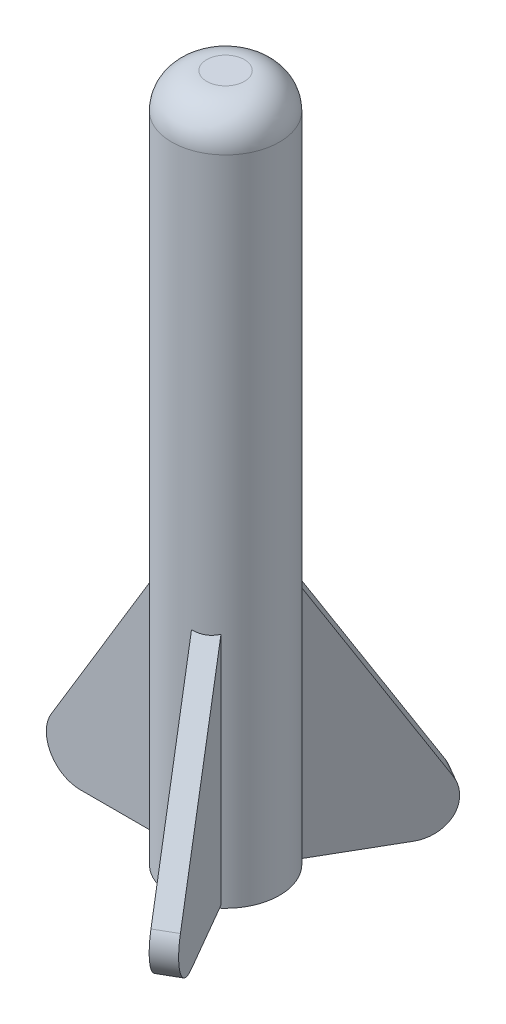
ISO-10303-21;
HEADER;
FILE_DESCRIPTION(('STEP AP214'),'2;1');
FILE_NAME('part.step','',(''),(''),'','','');
FILE_SCHEMA(('AUTOMOTIVE_DESIGN { 1 0 10303 214 1 1 1 1 }'));
ENDSEC;
DATA;
#1=APPLICATION_CONTEXT('core data for automotive mechanical design processes');
#2=APPLICATION_PROTOCOL_DEFINITION('international standard','automotive_design',2000,#1);
#3=PRODUCT_CONTEXT('',#1,'mechanical');
#4=PRODUCT('Part','Part','',(#3));
#5=PRODUCT_RELATED_PRODUCT_CATEGORY('part','',(#4));
#6=PRODUCT_DEFINITION_FORMATION('','',#4);
#7=PRODUCT_DEFINITION_CONTEXT('part definition',#1,'design');
#8=PRODUCT_DEFINITION('design','',#6,#7);
#9=PRODUCT_DEFINITION_SHAPE('','',#8);
#10=(LENGTH_UNIT() NAMED_UNIT(*) SI_UNIT(.MILLI.,.METRE.));
#11=(NAMED_UNIT(*) PLANE_ANGLE_UNIT() SI_UNIT($,.RADIAN.));
#12=(NAMED_UNIT(*) SI_UNIT($,.STERADIAN.) SOLID_ANGLE_UNIT());
#13=UNCERTAINTY_MEASURE_WITH_UNIT(LENGTH_MEASURE(1.E-05),#10,'distance_accuracy_value','');
#14=(GEOMETRIC_REPRESENTATION_CONTEXT(3) GLOBAL_UNCERTAINTY_ASSIGNED_CONTEXT((#13)) GLOBAL_UNIT_ASSIGNED_CONTEXT((#10,
#11,#12)) REPRESENTATION_CONTEXT('',''));
#15=CARTESIAN_POINT('',(0.,0.,0.));
#16=DIRECTION('',(0.,0.,1.));
#17=DIRECTION('',(1.,0.,0.));
#18=AXIS2_PLACEMENT_3D('',#15,#16,#17);
#19=CARTESIAN_POINT('',(0.,64.77,0.));
#20=DIRECTION('',(0.,-1.,0.));
#21=DIRECTION('',(0.,0.,-1.));
#22=AXIS2_PLACEMENT_3D('',#19,#20,#21);
#23=CYLINDRICAL_SURFACE('',#22,5.08);
#24=DIRECTION('',(0.,-1.,0.));
#25=VECTOR('',#24,1.);
#26=CARTESIAN_POINT('',(1.60879976842274,64.77,-4.81852293811319));
#27=LINE('',#26,#25);
#28=CARTESIAN_POINT('',(1.60879976842274,0.254000000000001,-4.81852293811319));
#29=VERTEX_POINT('',#28);
#30=CARTESIAN_POINT('',(1.60879976842274,22.3554057622066,-4.81852293811319));
#31=VERTEX_POINT('',#30);
#32=EDGE_CURVE('E226',#29,#31,#27,.F.);
#33=ORIENTED_EDGE('',*,*,#32,.F.);
#34=CARTESIAN_POINT('',(0.,0.254000000000004,0.));
#35=DIRECTION('',(0.,-1.,0.));
#36=DIRECTION('',(0.,0.,-1.));
#37=AXIS2_PLACEMENT_3D('',#34,#35,#36);
#38=CIRCLE('',#37,5.08);
#39=CARTESIAN_POINT('',(3.36856338891272,0.254000000000001,-3.80252293811318));
#40=VERTEX_POINT('',#39);
#41=EDGE_CURVE('E220',#29,#40,#38,.T.);
#42=ORIENTED_EDGE('',*,*,#41,.T.);
#43=DIRECTION('',(0.,-1.,0.));
#44=VECTOR('',#43,1.);
#45=CARTESIAN_POINT('',(3.36856338891272,64.77,-3.80252293811318));
#46=LINE('',#45,#44);
#47=CARTESIAN_POINT('',(3.36856338891272,22.3554057622066,-3.80252293811318));
#48=VERTEX_POINT('',#47);
#49=EDGE_CURVE('E217',#40,#48,#46,.F.);
#50=ORIENTED_EDGE('',*,*,#49,.T.);
#51=CARTESIAN_POINT('',(0.,30.595842527605,0.));
#52=DIRECTION('',(0.427986136650904,0.517021728110673,-0.741293733614474));
#53=DIRECTION('',(0.258510864055339,-0.855972273301801,-0.447753950852373));
#54=AXIS2_PLACEMENT_3D('',#51,#52,#53);
#55=ELLIPSE('',#54,9.82550582267324,5.08);
#56=EDGE_CURVE('E223',#48,#31,#55,.T.);
#57=ORIENTED_EDGE('',*,*,#56,.T.);
#58=EDGE_LOOP('',(#33,#42,#50,#57));
#59=FACE_BOUND('',#58,.T.);
#60=CARTESIAN_POINT('',(0.,0.,0.));
#61=DIRECTION('',(0.,1.,0.));
#62=DIRECTION('',(0.,0.,1.));
#63=AXIS2_PLACEMENT_3D('',#60,#61,#62);
#64=CIRCLE('',#63,5.08);
#65=CARTESIAN_POINT('',(0.,0.,5.08));
#66=VERTEX_POINT('',#65);
#67=EDGE_CURVE('E197',#66,#66,#64,.T.);
#68=ORIENTED_EDGE('',*,*,#67,.T.);
#69=EDGE_LOOP('',(#68));
#70=FACE_BOUND('',#69,.T.);
#71=CARTESIAN_POINT('',(0.,61.468,0.));
#72=DIRECTION('',(0.,1.,0.));
#73=DIRECTION('',(0.,0.,1.));
#74=AXIS2_PLACEMENT_3D('',#71,#72,#73);
#75=CIRCLE('',#74,5.08);
#76=CARTESIAN_POINT('',(0.,61.468,5.08));
#77=VERTEX_POINT('',#76);
#78=EDGE_CURVE('E203',#77,#77,#75,.F.);
#79=ORIENTED_EDGE('',*,*,#78,.T.);
#80=EDGE_LOOP('',(#79));
#81=FACE_BOUND('',#80,.T.);
#82=DIRECTION('',(0.,-1.,0.));
#83=VECTOR('',#82,1.);
#84=CARTESIAN_POINT('',(-4.97736315733542,64.77,1.016));
#85=LINE('',#84,#83);
#86=CARTESIAN_POINT('',(-4.97736315733542,0.254000000000001,1.016));
#87=VERTEX_POINT('',#86);
#88=CARTESIAN_POINT('',(-4.97736315733542,22.3554057622066,1.016));
#89=VERTEX_POINT('',#88);
#90=EDGE_CURVE('E215',#87,#89,#85,.F.);
#91=ORIENTED_EDGE('',*,*,#90,.F.);
#92=CARTESIAN_POINT('',(0.,0.254000000000004,0.));
#93=DIRECTION('',(0.,-1.,0.));
#94=DIRECTION('',(1.,0.,0.));
#95=AXIS2_PLACEMENT_3D('',#92,#93,#94);
#96=CIRCLE('',#95,5.08);
#97=CARTESIAN_POINT('',(-4.97736315733542,0.254000000000001,-1.016));
#98=VERTEX_POINT('',#97);
#99=EDGE_CURVE('E209',#87,#98,#96,.T.);
#100=ORIENTED_EDGE('',*,*,#99,.T.);
#101=DIRECTION('',(0.,-1.,0.));
#102=VECTOR('',#101,1.);
#103=CARTESIAN_POINT('',(-4.97736315733542,64.77,-1.016));
#104=LINE('',#103,#102);
#105=CARTESIAN_POINT('',(-4.97736315733542,22.3554057622066,-1.016));
#106=VERTEX_POINT('',#105);
#107=EDGE_CURVE('E206',#98,#106,#104,.F.);
#108=ORIENTED_EDGE('',*,*,#107,.T.);
#109=CARTESIAN_POINT('',(0.,30.595842527605,0.));
#110=DIRECTION('',(-0.855972273301801,0.517021728110673,0.));
#111=DIRECTION('',(-0.517021728110673,-0.855972273301801,0.));
#112=AXIS2_PLACEMENT_3D('',#109,#110,#111);
#113=ELLIPSE('',#112,9.82550582267324,5.08);
#114=EDGE_CURVE('E212',#106,#89,#113,.T.);
#115=ORIENTED_EDGE('',*,*,#114,.T.);
#116=EDGE_LOOP('',(#91,#100,#108,#115));
#117=FACE_BOUND('',#116,.T.);
#118=DIRECTION('',(0.,-1.,0.));
#119=VECTOR('',#118,1.);
#120=CARTESIAN_POINT('',(3.36856338891266,64.77,3.80252293811323));
#121=LINE('',#120,#119);
#122=CARTESIAN_POINT('',(3.36856338891266,0.254000000000001,3.80252293811323));
#123=VERTEX_POINT('',#122);
#124=CARTESIAN_POINT('',(3.36856338891267,22.3554057622066,3.80252293811323));
#125=VERTEX_POINT('',#124);
#126=EDGE_CURVE('E11',#123,#125,#121,.F.);
#127=ORIENTED_EDGE('',*,*,#126,.F.);
#128=CARTESIAN_POINT('',(0.,0.254000000000004,0.));
#129=DIRECTION('',(0.,-1.,0.));
#130=DIRECTION('',(0.,0.,-1.));
#131=AXIS2_PLACEMENT_3D('',#128,#129,#130);
#132=CIRCLE('',#131,5.08);
#133=CARTESIAN_POINT('',(1.60879976842267,0.254000000000001,4.81852293811321));
#134=VERTEX_POINT('',#133);
#135=EDGE_CURVE('E129',#123,#134,#132,.T.);
#136=ORIENTED_EDGE('',*,*,#135,.T.);
#137=DIRECTION('',(0.,-1.,0.));
#138=VECTOR('',#137,1.);
#139=CARTESIAN_POINT('',(1.60879976842268,64.77,4.81852293811321));
#140=LINE('',#139,#138);
#141=CARTESIAN_POINT('',(1.60879976842268,22.3554057622066,4.81852293811321));
#142=VERTEX_POINT('',#141);
#143=EDGE_CURVE('E228',#134,#142,#140,.F.);
#144=ORIENTED_EDGE('',*,*,#143,.T.);
#145=CARTESIAN_POINT('',(0.,30.595842527605,0.));
#146=DIRECTION('',(0.427986136650894,0.517021728110673,0.74129373361448));
#147=DIRECTION('',(0.258510864055332,-0.855972273301801,0.447753950852376));
#148=AXIS2_PLACEMENT_3D('',#145,#146,#147);
#149=ELLIPSE('',#148,9.82550582267324,5.08);
#150=EDGE_CURVE('E40',#142,#125,#149,.T.);
#151=ORIENTED_EDGE('',*,*,#150,.T.);
#152=EDGE_LOOP('',(#127,#136,#144,#151));
#153=FACE_BOUND('',#152,.T.);
#154=ADVANCED_FACE('F32',(#59,#70,#81,#117,#153),#23,.T.);
#155=CARTESIAN_POINT('',(0.,0.,0.));
#156=DIRECTION('',(0.,1.,0.));
#157=DIRECTION('',(0.,0.,1.));
#158=AXIS2_PLACEMENT_3D('',#155,#156,#157);
#159=PLANE('',#158);
#160=ORIENTED_EDGE('',*,*,#67,.F.);
#161=EDGE_LOOP('',(#160));
#162=FACE_BOUND('',#161,.T.);
#163=CARTESIAN_POINT('',(0.,0.,0.));
#164=DIRECTION('',(0.,-1.,0.));
#165=DIRECTION('',(1.,0.,0.));
#166=AXIS2_PLACEMENT_3D('',#163,#164,#165);
#167=CIRCLE('',#166,2.79399999999999);
#168=CARTESIAN_POINT('',(2.79399999999999,0.,0.));
#169=VERTEX_POINT('',#168);
#170=EDGE_CURVE('E189',#169,#169,#167,.T.);
#171=ORIENTED_EDGE('',*,*,#170,.F.);
#172=EDGE_LOOP('',(#171));
#173=FACE_BOUND('',#172,.T.);
#174=ADVANCED_FACE('F246',(#162,#173),#159,.F.);
#175=CARTESIAN_POINT('',(0.,64.77,0.));
#176=DIRECTION('',(0.,1.,0.));
#177=DIRECTION('',(0.,0.,1.));
#178=AXIS2_PLACEMENT_3D('',#175,#176,#177);
#179=PLANE('',#178);
#180=CARTESIAN_POINT('',(0.,64.77,0.));
#181=DIRECTION('',(0.,1.,0.));
#182=DIRECTION('',(0.,0.,1.));
#183=AXIS2_PLACEMENT_3D('',#180,#181,#182);
#184=CIRCLE('',#183,1.778);
#185=CARTESIAN_POINT('',(0.,64.77,1.778));
#186=VERTEX_POINT('',#185);
#187=EDGE_CURVE('E200',#186,#186,#184,.T.);
#188=ORIENTED_EDGE('',*,*,#187,.T.);
#189=EDGE_LOOP('',(#188));
#190=FACE_BOUND('',#189,.T.);
#191=ADVANCED_FACE('F251',(#190),#179,.T.);
#192=CARTESIAN_POINT('',(0.,61.468,0.));
#193=DIRECTION('',(0.,1.,0.));
#194=DIRECTION('',(0.,0.,1.));
#195=AXIS2_PLACEMENT_3D('',#192,#193,#194);
#196=DEGENERATE_TOROIDAL_SURFACE('',#195,1.778,3.302,.T.);
#197=ORIENTED_EDGE('',*,*,#78,.F.);
#198=EDGE_LOOP('',(#197));
#199=FACE_BOUND('',#198,.T.);
#200=ORIENTED_EDGE('',*,*,#187,.F.);
#201=EDGE_LOOP('',(#200));
#202=FACE_BOUND('',#201,.T.);
#203=ADVANCED_FACE('F34',(#199,#202),#196,.T.);
#204=CARTESIAN_POINT('',(0.,33.0835,0.));
#205=DIRECTION('',(0.,-1.,0.));
#206=DIRECTION('',(1.,0.,0.));
#207=AXIS2_PLACEMENT_3D('',#204,#205,#206);
#208=PLANE('',#207);
#209=CARTESIAN_POINT('',(0.,33.0835,0.));
#210=DIRECTION('',(0.,-1.,0.));
#211=DIRECTION('',(1.,0.,0.));
#212=AXIS2_PLACEMENT_3D('',#209,#210,#211);
#213=CIRCLE('',#212,2.794);
#214=CARTESIAN_POINT('',(2.794,33.0835,0.));
#215=VERTEX_POINT('',#214);
#216=EDGE_CURVE('E194',#215,#215,#213,.T.);
#217=ORIENTED_EDGE('',*,*,#216,.T.);
#218=EDGE_LOOP('',(#217));
#219=FACE_BOUND('',#218,.T.);
#220=ADVANCED_FACE('F260',(#219),#208,.T.);
#221=CARTESIAN_POINT('',(0.,33.0835,0.));
#222=DIRECTION('',(0.,-1.,0.));
#223=DIRECTION('',(1.,0.,0.));
#224=AXIS2_PLACEMENT_3D('',#221,#222,#223);
#225=CYLINDRICAL_SURFACE('',#224,2.79399999999999);
#226=ORIENTED_EDGE('',*,*,#170,.T.);
#227=EDGE_LOOP('',(#226));
#228=FACE_BOUND('',#227,.T.);
#229=ORIENTED_EDGE('',*,*,#216,.F.);
#230=EDGE_LOOP('',(#229));
#231=FACE_BOUND('',#230,.T.);
#232=ADVANCED_FACE('F263',(#228,#231),#225,.F.);
#233=CARTESIAN_POINT('',(-15.4177119677332,5.07054398675139,1.016));
#234=DIRECTION('',(-0.855972273301801,0.517021728110673,0.));
#235=DIRECTION('',(-0.517021728110673,-0.855972273301801,0.));
#236=AXIS2_PLACEMENT_3D('',#233,#234,#235);
#237=PLANE('',#236);
#238=ORIENTED_EDGE('',*,*,#114,.F.);
#239=DIRECTION('',(0.517021728110673,0.855972273301801,0.));
#240=VECTOR('',#239,1.);
#241=CARTESIAN_POINT('',(-15.4177119677332,5.07054398675139,-1.016));
#242=LINE('',#241,#240);
#243=CARTESIAN_POINT('',(-15.4177119677332,5.07054398675139,-1.016));
#244=VERTEX_POINT('',#243);
#245=EDGE_CURVE('E175',#244,#106,#242,.T.);
#246=ORIENTED_EDGE('',*,*,#245,.F.);
#247=DIRECTION('',(0.,0.,-1.));
#248=VECTOR('',#247,1.);
#249=CARTESIAN_POINT('',(-15.4177119677332,5.07054398675139,1.016));
#250=LINE('',#249,#248);
#251=CARTESIAN_POINT('',(-15.4177119677332,5.07054398675139,1.016));
#252=VERTEX_POINT('',#251);
#253=EDGE_CURVE('E187',#252,#244,#250,.T.);
#254=ORIENTED_EDGE('',*,*,#253,.F.);
#255=DIRECTION('',(0.517021728110673,0.855972273301801,0.));
#256=VECTOR('',#255,1.);
#257=CARTESIAN_POINT('',(-15.4177119677332,5.07054398675139,1.016));
#258=LINE('',#257,#256);
#259=EDGE_CURVE('E178',#252,#89,#258,.T.);
#260=ORIENTED_EDGE('',*,*,#259,.T.);
#261=EDGE_LOOP('',(#238,#246,#254,#260));
#262=FACE_BOUND('',#261,.T.);
#263=ADVANCED_FACE('F267',(#262),#237,.T.);
#264=CARTESIAN_POINT('',(-4.826,0.254000000000001,1.016));
#265=DIRECTION('',(0.,-1.,0.));
#266=DIRECTION('',(1.,0.,0.));
#267=AXIS2_PLACEMENT_3D('',#264,#265,#266);
#268=PLANE('',#267);
#269=ORIENTED_EDGE('',*,*,#99,.F.);
#270=DIRECTION('',(-1.,0.,0.));
#271=VECTOR('',#270,1.);
#272=CARTESIAN_POINT('',(-4.826,0.254000000000001,1.016));
#273=LINE('',#272,#271);
#274=CARTESIAN_POINT('',(-12.7,0.253999999999999,1.016));
#275=VERTEX_POINT('',#274);
#276=EDGE_CURVE('E172',#87,#275,#273,.T.);
#277=ORIENTED_EDGE('',*,*,#276,.T.);
#278=DIRECTION('',(0.,0.,-1.));
#279=VECTOR('',#278,1.);
#280=CARTESIAN_POINT('',(-12.7,0.253999999999999,1.016));
#281=LINE('',#280,#279);
#282=CARTESIAN_POINT('',(-12.7,0.253999999999999,-1.016));
#283=VERTEX_POINT('',#282);
#284=EDGE_CURVE('E181',#275,#283,#281,.T.);
#285=ORIENTED_EDGE('',*,*,#284,.T.);
#286=DIRECTION('',(-1.,0.,0.));
#287=VECTOR('',#286,1.);
#288=CARTESIAN_POINT('',(-4.826,0.254000000000001,-1.016));
#289=LINE('',#288,#287);
#290=EDGE_CURVE('E169',#98,#283,#289,.T.);
#291=ORIENTED_EDGE('',*,*,#290,.F.);
#292=EDGE_LOOP('',(#269,#277,#285,#291));
#293=FACE_BOUND('',#292,.T.);
#294=ADVANCED_FACE('F269',(#293),#268,.T.);
#295=CARTESIAN_POINT('',(-12.7,3.429,1.016));
#296=DIRECTION('',(0.,0.,-1.));
#297=DIRECTION('',(-1.,0.,0.));
#298=AXIS2_PLACEMENT_3D('',#295,#296,#297);
#299=PLANE('',#298);
#300=ORIENTED_EDGE('',*,*,#276,.F.);
#301=ORIENTED_EDGE('',*,*,#90,.T.);
#302=ORIENTED_EDGE('',*,*,#259,.F.);
#303=CARTESIAN_POINT('',(-12.7,3.429,1.016));
#304=DIRECTION('',(0.,0.,-1.));
#305=DIRECTION('',(-1.,0.,0.));
#306=AXIS2_PLACEMENT_3D('',#303,#304,#305);
#307=CIRCLE('',#306,3.175);
#308=EDGE_CURVE('E174',#275,#252,#307,.T.);
#309=ORIENTED_EDGE('',*,*,#308,.F.);
#310=EDGE_LOOP('',(#300,#301,#302,#309));
#311=FACE_BOUND('',#310,.T.);
#312=ADVANCED_FACE('F272',(#311),#299,.F.);
#313=CARTESIAN_POINT('',(-12.7,3.429,-1.016));
#314=DIRECTION('',(0.,0.,-1.));
#315=DIRECTION('',(-1.,0.,0.));
#316=AXIS2_PLACEMENT_3D('',#313,#314,#315);
#317=PLANE('',#316);
#318=ORIENTED_EDGE('',*,*,#107,.F.);
#319=ORIENTED_EDGE('',*,*,#290,.T.);
#320=CARTESIAN_POINT('',(-12.7,3.429,-1.016));
#321=DIRECTION('',(0.,0.,-1.));
#322=DIRECTION('',(-1.,0.,0.));
#323=AXIS2_PLACEMENT_3D('',#320,#321,#322);
#324=CIRCLE('',#323,3.175);
#325=EDGE_CURVE('E183',#283,#244,#324,.T.);
#326=ORIENTED_EDGE('',*,*,#325,.T.);
#327=ORIENTED_EDGE('',*,*,#245,.T.);
#328=EDGE_LOOP('',(#318,#319,#326,#327));
#329=FACE_BOUND('',#328,.T.);
#330=ADVANCED_FACE('F278',(#329),#317,.T.);
#331=CARTESIAN_POINT('',(-12.7,3.429,1.016));
#332=DIRECTION('',(0.,0.,-1.));
#333=DIRECTION('',(-1.,0.,0.));
#334=AXIS2_PLACEMENT_3D('',#331,#332,#333);
#335=CYLINDRICAL_SURFACE('',#334,3.175);
#336=ORIENTED_EDGE('',*,*,#325,.F.);
#337=ORIENTED_EDGE('',*,*,#284,.F.);
#338=ORIENTED_EDGE('',*,*,#308,.T.);
#339=ORIENTED_EDGE('',*,*,#253,.T.);
#340=EDGE_LOOP('',(#336,#337,#338,#339));
#341=FACE_BOUND('',#340,.T.);
#342=ADVANCED_FACE('F274',(#341),#335,.T.);
#343=CARTESIAN_POINT('',(6.82897417362168,5.07054398675139,-13.8601302322883));
#344=DIRECTION('',(0.427986136650904,0.517021728110673,-0.741293733614474));
#345=DIRECTION('',(0.,0.820209992758659,0.572062555826581));
#346=AXIS2_PLACEMENT_3D('',#343,#344,#345);
#347=PLANE('',#346);
#348=ORIENTED_EDGE('',*,*,#56,.F.);
#349=DIRECTION('',(-0.258510864055339,0.855972273301801,0.447753950852373));
#350=VECTOR('',#349,1.);
#351=CARTESIAN_POINT('',(8.58873779411166,5.07054398675139,-12.8441302322883));
#352=LINE('',#351,#350);
#353=CARTESIAN_POINT('',(8.58873779411166,5.07054398675139,-12.8441302322883));
#354=VERTEX_POINT('',#353);
#355=EDGE_CURVE('E55',#354,#48,#352,.T.);
#356=ORIENTED_EDGE('',*,*,#355,.F.);
#357=DIRECTION('',(0.866025403784436,0.,0.500000000000004));
#358=VECTOR('',#357,1.);
#359=CARTESIAN_POINT('',(6.82897417362168,5.07054398675139,-13.8601302322883));
#360=LINE('',#359,#358);
#361=CARTESIAN_POINT('',(6.82897417362168,5.07054398675139,-13.8601302322883));
#362=VERTEX_POINT('',#361);
#363=EDGE_CURVE('E167',#362,#354,#360,.T.);
#364=ORIENTED_EDGE('',*,*,#363,.F.);
#365=DIRECTION('',(-0.258510864055339,0.855972273301801,0.447753950852373));
#366=VECTOR('',#365,1.);
#367=CARTESIAN_POINT('',(6.82897417362168,5.07054398675139,-13.8601302322883));
#368=LINE('',#367,#366);
#369=EDGE_CURVE('E159',#362,#31,#368,.T.);
#370=ORIENTED_EDGE('',*,*,#369,.T.);
#371=EDGE_LOOP('',(#348,#356,#364,#370));
#372=FACE_BOUND('',#371,.T.);
#373=ADVANCED_FACE('F277',(#372),#347,.T.);
#374=CARTESIAN_POINT('',(1.53311818975503,0.254000000000001,-4.68743859866369));
#375=DIRECTION('',(0.,-1.,0.));
#376=DIRECTION('',(0.,0.,-1.));
#377=AXIS2_PLACEMENT_3D('',#374,#375,#376);
#378=PLANE('',#377);
#379=ORIENTED_EDGE('',*,*,#41,.F.);
#380=DIRECTION('',(0.500000000000004,0.,-0.866025403784436));
#381=VECTOR('',#380,1.);
#382=CARTESIAN_POINT('',(1.53311818975503,0.254000000000001,-4.68743859866369));
#383=LINE('',#382,#381);
#384=CARTESIAN_POINT('',(5.47011818975506,0.253999999999999,-11.5065226280623));
#385=VERTEX_POINT('',#384);
#386=EDGE_CURVE('E154',#29,#385,#383,.T.);
#387=ORIENTED_EDGE('',*,*,#386,.T.);
#388=DIRECTION('',(0.866025403784436,0.,0.500000000000004));
#389=VECTOR('',#388,1.);
#390=CARTESIAN_POINT('',(5.47011818975506,0.253999999999999,-11.5065226280623));
#391=LINE('',#390,#389);
#392=CARTESIAN_POINT('',(7.22988181024504,0.253999999999999,-10.4905226280623));
#393=VERTEX_POINT('',#392);
#394=EDGE_CURVE('E162',#385,#393,#391,.T.);
#395=ORIENTED_EDGE('',*,*,#394,.T.);
#396=DIRECTION('',(0.500000000000004,0.,-0.866025403784436));
#397=VECTOR('',#396,1.);
#398=CARTESIAN_POINT('',(3.29288181024501,0.254000000000001,-3.67143859866368));
#399=LINE('',#398,#397);
#400=EDGE_CURVE('E152',#40,#393,#399,.T.);
#401=ORIENTED_EDGE('',*,*,#400,.F.);
#402=EDGE_LOOP('',(#379,#387,#395,#401));
#403=FACE_BOUND('',#402,.T.);
#404=ADVANCED_FACE('F289',(#403),#378,.T.);
#405=CARTESIAN_POINT('',(5.47011818975506,3.429,-11.5065226280623));
#406=DIRECTION('',(0.866025403784436,0.,0.500000000000004));
#407=DIRECTION('',(0.500000000000004,0.,-0.866025403784436));
#408=AXIS2_PLACEMENT_3D('',#405,#406,#407);
#409=PLANE('',#408);
#410=ORIENTED_EDGE('',*,*,#386,.F.);
#411=ORIENTED_EDGE('',*,*,#32,.T.);
#412=ORIENTED_EDGE('',*,*,#369,.F.);
#413=CARTESIAN_POINT('',(5.47011818975506,3.429,-11.5065226280623));
#414=DIRECTION('',(0.866025403784436,0.,0.500000000000004));
#415=DIRECTION('',(0.500000000000004,0.,-0.866025403784436));
#416=AXIS2_PLACEMENT_3D('',#413,#414,#415);
#417=CIRCLE('',#416,3.175);
#418=EDGE_CURVE('E156',#385,#362,#417,.T.);
#419=ORIENTED_EDGE('',*,*,#418,.F.);
#420=EDGE_LOOP('',(#410,#411,#412,#419));
#421=FACE_BOUND('',#420,.T.);
#422=ADVANCED_FACE('F292',(#421),#409,.F.);
#423=CARTESIAN_POINT('',(7.22988181024504,3.429,-10.4905226280623));
#424=DIRECTION('',(0.866025403784436,0.,0.500000000000004));
#425=DIRECTION('',(0.500000000000004,0.,-0.866025403784436));
#426=AXIS2_PLACEMENT_3D('',#423,#424,#425);
#427=PLANE('',#426);
#428=ORIENTED_EDGE('',*,*,#49,.F.);
#429=ORIENTED_EDGE('',*,*,#400,.T.);
#430=CARTESIAN_POINT('',(7.22988181024504,3.429,-10.4905226280623));
#431=DIRECTION('',(0.866025403784436,0.,0.500000000000004));
#432=DIRECTION('',(0.500000000000004,0.,-0.866025403784436));
#433=AXIS2_PLACEMENT_3D('',#430,#431,#432);
#434=CIRCLE('',#433,3.175);
#435=EDGE_CURVE('E164',#393,#354,#434,.T.);
#436=ORIENTED_EDGE('',*,*,#435,.T.);
#437=ORIENTED_EDGE('',*,*,#355,.T.);
#438=EDGE_LOOP('',(#428,#429,#436,#437));
#439=FACE_BOUND('',#438,.T.);
#440=ADVANCED_FACE('F297',(#439),#427,.T.);
#441=CARTESIAN_POINT('',(5.47011818975506,3.429,-11.5065226280623));
#442=DIRECTION('',(0.866025403784436,0.,0.500000000000004));
#443=DIRECTION('',(0.500000000000004,0.,-0.866025403784436));
#444=AXIS2_PLACEMENT_3D('',#441,#442,#443);
#445=CYLINDRICAL_SURFACE('',#444,3.175);
#446=ORIENTED_EDGE('',*,*,#435,.F.);
#447=ORIENTED_EDGE('',*,*,#394,.F.);
#448=ORIENTED_EDGE('',*,*,#418,.T.);
#449=ORIENTED_EDGE('',*,*,#363,.T.);
#450=EDGE_LOOP('',(#446,#447,#448,#449));
#451=FACE_BOUND('',#450,.T.);
#452=ADVANCED_FACE('F294',(#451),#445,.T.);
#453=CARTESIAN_POINT('',(8.58873779411148,5.07054398675139,12.8441302322884));
#454=DIRECTION('',(0.427986136650894,0.517021728110673,0.74129373361448));
#455=DIRECTION('',(0.,-0.820209992758661,0.572062555826578));
#456=AXIS2_PLACEMENT_3D('',#453,#454,#455);
#457=PLANE('',#456);
#458=ORIENTED_EDGE('',*,*,#150,.F.);
#459=DIRECTION('',(-0.258510864055332,0.855972273301801,-0.447753950852376));
#460=VECTOR('',#459,1.);
#461=CARTESIAN_POINT('',(6.82897417362149,5.07054398675139,13.8601302322884));
#462=LINE('',#461,#460);
#463=CARTESIAN_POINT('',(6.82897417362149,5.07054398675139,13.8601302322884));
#464=VERTEX_POINT('',#463);
#465=EDGE_CURVE('E47',#464,#142,#462,.T.);
#466=ORIENTED_EDGE('',*,*,#465,.F.);
#467=DIRECTION('',(-0.866025403784443,0.,0.499999999999992));
#468=VECTOR('',#467,1.);
#469=CARTESIAN_POINT('',(8.58873779411148,5.07054398675139,12.8441302322884));
#470=LINE('',#469,#468);
#471=CARTESIAN_POINT('',(8.58873779411148,5.07054398675139,12.8441302322884));
#472=VERTEX_POINT('',#471);
#473=EDGE_CURVE('E140',#472,#464,#470,.T.);
#474=ORIENTED_EDGE('',*,*,#473,.F.);
#475=DIRECTION('',(-0.258510864055332,0.855972273301801,-0.447753950852376));
#476=VECTOR('',#475,1.);
#477=CARTESIAN_POINT('',(8.58873779411148,5.07054398675139,12.8441302322884));
#478=LINE('',#477,#476);
#479=EDGE_CURVE('E141',#472,#125,#478,.T.);
#480=ORIENTED_EDGE('',*,*,#479,.T.);
#481=EDGE_LOOP('',(#458,#466,#474,#480));
#482=FACE_BOUND('',#481,.T.);
#483=ADVANCED_FACE('F234',(#482),#457,.T.);
#484=CARTESIAN_POINT('',(3.29288181024495,0.254000000000001,3.67143859866373));
#485=DIRECTION('',(0.,-1.,0.));
#486=DIRECTION('',(0.,0.,-1.));
#487=AXIS2_PLACEMENT_3D('',#484,#485,#486);
#488=PLANE('',#487);
#489=ORIENTED_EDGE('',*,*,#135,.F.);
#490=DIRECTION('',(0.499999999999992,0.,0.866025403784443));
#491=VECTOR('',#490,1.);
#492=CARTESIAN_POINT('',(3.29288181024495,0.254000000000001,3.67143859866373));
#493=LINE('',#492,#491);
#494=CARTESIAN_POINT('',(7.22988181024489,0.253999999999999,10.4905226280624));
#495=VERTEX_POINT('',#494);
#496=EDGE_CURVE('E122',#123,#495,#493,.T.);
#497=ORIENTED_EDGE('',*,*,#496,.T.);
#498=DIRECTION('',(-0.866025403784443,0.,0.499999999999992));
#499=VECTOR('',#498,1.);
#500=CARTESIAN_POINT('',(7.22988181024489,0.253999999999999,10.4905226280624));
#501=LINE('',#500,#499);
#502=CARTESIAN_POINT('',(5.4701181897549,0.253999999999999,11.5065226280624));
#503=VERTEX_POINT('',#502);
#504=EDGE_CURVE('E126',#495,#503,#501,.T.);
#505=ORIENTED_EDGE('',*,*,#504,.T.);
#506=DIRECTION('',(0.499999999999992,0.,0.866025403784443));
#507=VECTOR('',#506,1.);
#508=CARTESIAN_POINT('',(1.53311818975497,0.254000000000001,4.68743859866371));
#509=LINE('',#508,#507);
#510=EDGE_CURVE('E148',#134,#503,#509,.T.);
#511=ORIENTED_EDGE('',*,*,#510,.F.);
#512=EDGE_LOOP('',(#489,#497,#505,#511));
#513=FACE_BOUND('',#512,.T.);
#514=ADVANCED_FACE('F124',(#513),#488,.T.);
#515=CARTESIAN_POINT('',(7.22988181024489,3.429,10.4905226280624));
#516=DIRECTION('',(-0.866025403784443,0.,0.499999999999992));
#517=DIRECTION('',(0.499999999999992,0.,0.866025403784443));
#518=AXIS2_PLACEMENT_3D('',#515,#516,#517);
#519=PLANE('',#518);
#520=ORIENTED_EDGE('',*,*,#496,.F.);
#521=ORIENTED_EDGE('',*,*,#126,.T.);
#522=ORIENTED_EDGE('',*,*,#479,.F.);
#523=CARTESIAN_POINT('',(7.22988181024489,3.429,10.4905226280624));
#524=DIRECTION('',(-0.866025403784443,0.,0.499999999999992));
#525=DIRECTION('',(0.499999999999992,0.,0.866025403784443));
#526=AXIS2_PLACEMENT_3D('',#523,#524,#525);
#527=CIRCLE('',#526,3.175);
#528=EDGE_CURVE('E133',#495,#472,#527,.T.);
#529=ORIENTED_EDGE('',*,*,#528,.F.);
#530=EDGE_LOOP('',(#520,#521,#522,#529));
#531=FACE_BOUND('',#530,.T.);
#532=ADVANCED_FACE('F143',(#531),#519,.F.);
#533=CARTESIAN_POINT('',(5.4701181897549,3.429,11.5065226280624));
#534=DIRECTION('',(-0.866025403784443,0.,0.499999999999992));
#535=DIRECTION('',(0.499999999999992,0.,0.866025403784443));
#536=AXIS2_PLACEMENT_3D('',#533,#534,#535);
#537=PLANE('',#536);
#538=ORIENTED_EDGE('',*,*,#143,.F.);
#539=ORIENTED_EDGE('',*,*,#510,.T.);
#540=CARTESIAN_POINT('',(5.4701181897549,3.429,11.5065226280624));
#541=DIRECTION('',(-0.866025403784443,0.,0.499999999999992));
#542=DIRECTION('',(0.499999999999992,0.,0.866025403784443));
#543=AXIS2_PLACEMENT_3D('',#540,#541,#542);
#544=CIRCLE('',#543,3.175);
#545=EDGE_CURVE('E139',#503,#464,#544,.T.);
#546=ORIENTED_EDGE('',*,*,#545,.T.);
#547=ORIENTED_EDGE('',*,*,#465,.T.);
#548=EDGE_LOOP('',(#538,#539,#546,#547));
#549=FACE_BOUND('',#548,.T.);
#550=ADVANCED_FACE('F235',(#549),#537,.T.);
#551=CARTESIAN_POINT('',(7.22988181024489,3.429,10.4905226280624));
#552=DIRECTION('',(-0.866025403784443,0.,0.499999999999992));
#553=DIRECTION('',(0.499999999999992,0.,0.866025403784443));
#554=AXIS2_PLACEMENT_3D('',#551,#552,#553);
#555=CYLINDRICAL_SURFACE('',#554,3.175);
#556=ORIENTED_EDGE('',*,*,#545,.F.);
#557=ORIENTED_EDGE('',*,*,#504,.F.);
#558=ORIENTED_EDGE('',*,*,#528,.T.);
#559=ORIENTED_EDGE('',*,*,#473,.T.);
#560=EDGE_LOOP('',(#556,#557,#558,#559));
#561=FACE_BOUND('',#560,.T.);
#562=ADVANCED_FACE('F137',(#561),#555,.T.);
#563=CLOSED_SHELL('',(#154,#174,#191,#203,#220,#232,#263,#294,#312,#330,#342,#373,#404,#422,
#440,#452,#483,#514,#532,#550,#562));
#564=MANIFOLD_SOLID_BREP('B2',#563);
#565=ADVANCED_BREP_SHAPE_REPRESENTATION('',(#18,#564),#14);
#566=SHAPE_DEFINITION_REPRESENTATION(#9,#565);
ENDSEC;
END-ISO-10303-21;
